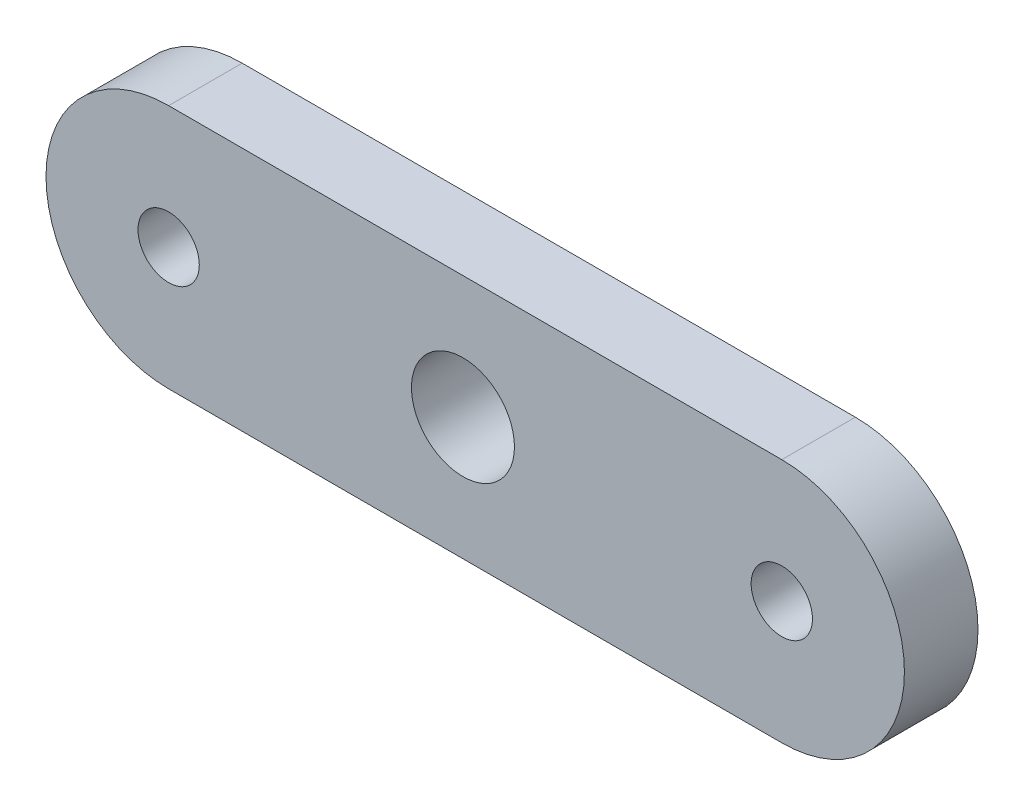
ISO-10303-21;
HEADER;
FILE_DESCRIPTION(('STEP AP214'),'2;1');
FILE_NAME('part.step','',(''),(''),'','','');
FILE_SCHEMA(('AUTOMOTIVE_DESIGN { 1 0 10303 214 1 1 1 1 }'));
ENDSEC;
DATA;
#1=APPLICATION_CONTEXT('core data for automotive mechanical design processes');
#2=APPLICATION_PROTOCOL_DEFINITION('international standard','automotive_design',2000,#1);
#3=PRODUCT_CONTEXT('',#1,'mechanical');
#4=PRODUCT('Part','Part','',(#3));
#5=PRODUCT_RELATED_PRODUCT_CATEGORY('part','',(#4));
#6=PRODUCT_DEFINITION_FORMATION('','',#4);
#7=PRODUCT_DEFINITION_CONTEXT('part definition',#1,'design');
#8=PRODUCT_DEFINITION('design','',#6,#7);
#9=PRODUCT_DEFINITION_SHAPE('','',#8);
#10=(LENGTH_UNIT() NAMED_UNIT(*) SI_UNIT(.MILLI.,.METRE.));
#11=(NAMED_UNIT(*) PLANE_ANGLE_UNIT() SI_UNIT($,.RADIAN.));
#12=(NAMED_UNIT(*) SI_UNIT($,.STERADIAN.) SOLID_ANGLE_UNIT());
#13=UNCERTAINTY_MEASURE_WITH_UNIT(LENGTH_MEASURE(1.E-05),#10,'distance_accuracy_value','');
#14=(GEOMETRIC_REPRESENTATION_CONTEXT(3) GLOBAL_UNCERTAINTY_ASSIGNED_CONTEXT((#13)) GLOBAL_UNIT_ASSIGNED_CONTEXT((#10,
#11,#12)) REPRESENTATION_CONTEXT('',''));
#15=CARTESIAN_POINT('',(0.,0.,0.));
#16=DIRECTION('',(0.,0.,1.));
#17=DIRECTION('',(1.,0.,0.));
#18=AXIS2_PLACEMENT_3D('',#15,#16,#17);
#19=CARTESIAN_POINT('',(-78.0152195047561,26.0203372792721,3.));
#20=DIRECTION('',(0.,0.,1.));
#21=DIRECTION('',(1.,0.,0.));
#22=AXIS2_PLACEMENT_3D('',#19,#20,#21);
#23=PLANE('',#22);
#24=CARTESIAN_POINT('',(-66.0152195047561,26.0203372792721,3.));
#25=DIRECTION('',(0.,0.,1.));
#26=DIRECTION('',(1.,0.,0.));
#27=AXIS2_PLACEMENT_3D('',#24,#25,#26);
#28=CIRCLE('',#27,2.1);
#29=CARTESIAN_POINT('',(-63.9152195047561,26.0203372792721,3.));
#30=VERTEX_POINT('',#29);
#31=EDGE_CURVE('E126',#30,#30,#28,.T.);
#32=ORIENTED_EDGE('',*,*,#31,.F.);
#33=EDGE_LOOP('',(#32));
#34=FACE_BOUND('',#33,.T.);
#35=CARTESIAN_POINT('',(-53.0152195047561,26.0203372792721,3.));
#36=DIRECTION('',(0.,0.,1.));
#37=DIRECTION('',(1.,0.,0.));
#38=AXIS2_PLACEMENT_3D('',#35,#36,#37);
#39=CIRCLE('',#38,1.25);
#40=CARTESIAN_POINT('',(-51.7652195047561,26.0203372792721,3.));
#41=VERTEX_POINT('',#40);
#42=EDGE_CURVE('E100',#41,#41,#39,.T.);
#43=ORIENTED_EDGE('',*,*,#42,.F.);
#44=EDGE_LOOP('',(#43));
#45=FACE_BOUND('',#44,.T.);
#46=CARTESIAN_POINT('',(-78.0152195047561,26.0203372792721,3.));
#47=DIRECTION('',(0.,0.,1.));
#48=DIRECTION('',(1.,0.,0.));
#49=AXIS2_PLACEMENT_3D('',#46,#47,#48);
#50=CIRCLE('',#49,5.);
#51=CARTESIAN_POINT('',(-78.0152195047561,31.0203372792721,3.));
#52=VERTEX_POINT('',#51);
#53=CARTESIAN_POINT('',(-78.0152195047561,21.0203372792721,3.));
#54=VERTEX_POINT('',#53);
#55=EDGE_CURVE('E85',#52,#54,#50,.T.);
#56=ORIENTED_EDGE('',*,*,#55,.T.);
#57=DIRECTION('',(1.,0.,0.));
#58=VECTOR('',#57,1.);
#59=CARTESIAN_POINT('',(-53.0152195047561,21.0203372792721,3.));
#60=LINE('',#59,#58);
#61=CARTESIAN_POINT('',(-53.0152195047561,21.0203372792721,3.));
#62=VERTEX_POINT('',#61);
#63=EDGE_CURVE('E80',#54,#62,#60,.T.);
#64=ORIENTED_EDGE('',*,*,#63,.T.);
#65=CARTESIAN_POINT('',(-53.0152195047561,26.0203372792721,3.));
#66=DIRECTION('',(0.,0.,1.));
#67=DIRECTION('',(1.,0.,0.));
#68=AXIS2_PLACEMENT_3D('',#65,#66,#67);
#69=CIRCLE('',#68,5.);
#70=CARTESIAN_POINT('',(-53.0152195047561,31.0203372792721,3.));
#71=VERTEX_POINT('',#70);
#72=EDGE_CURVE('E83',#62,#71,#69,.T.);
#73=ORIENTED_EDGE('',*,*,#72,.T.);
#74=DIRECTION('',(-1.,0.,0.));
#75=VECTOR('',#74,1.);
#76=CARTESIAN_POINT('',(-78.0152195047561,31.0203372792721,3.));
#77=LINE('',#76,#75);
#78=EDGE_CURVE('E50',#71,#52,#77,.T.);
#79=ORIENTED_EDGE('',*,*,#78,.T.);
#80=EDGE_LOOP('',(#56,#64,#73,#79));
#81=FACE_BOUND('',#80,.T.);
#82=CARTESIAN_POINT('',(-78.0152195047561,26.0203372792721,3.));
#83=DIRECTION('',(0.,0.,1.));
#84=DIRECTION('',(1.,0.,0.));
#85=AXIS2_PLACEMENT_3D('',#82,#83,#84);
#86=CIRCLE('',#85,1.25);
#87=CARTESIAN_POINT('',(-76.7652195047561,26.0203372792721,3.));
#88=VERTEX_POINT('',#87);
#89=EDGE_CURVE('E115',#88,#88,#86,.T.);
#90=ORIENTED_EDGE('',*,*,#89,.F.);
#91=EDGE_LOOP('',(#90));
#92=FACE_BOUND('',#91,.T.);
#93=ADVANCED_FACE('F33',(#34,#45,#81,#92),#23,.T.);
#94=CARTESIAN_POINT('',(-78.0152195047561,26.0203372792721,0.));
#95=DIRECTION('',(0.,0.,1.));
#96=DIRECTION('',(1.,0.,0.));
#97=AXIS2_PLACEMENT_3D('',#94,#95,#96);
#98=PLANE('',#97);
#99=CARTESIAN_POINT('',(-53.0152195047561,26.0203372792721,0.));
#100=DIRECTION('',(0.,0.,1.));
#101=DIRECTION('',(1.,0.,0.));
#102=AXIS2_PLACEMENT_3D('',#99,#100,#101);
#103=CIRCLE('',#102,1.25);
#104=CARTESIAN_POINT('',(-51.7652195047561,26.0203372792721,0.));
#105=VERTEX_POINT('',#104);
#106=EDGE_CURVE('E112',#105,#105,#103,.T.);
#107=ORIENTED_EDGE('',*,*,#106,.T.);
#108=EDGE_LOOP('',(#107));
#109=FACE_BOUND('',#108,.T.);
#110=CARTESIAN_POINT('',(-78.0152195047561,26.0203372792721,0.));
#111=DIRECTION('',(0.,0.,1.));
#112=DIRECTION('',(1.,0.,0.));
#113=AXIS2_PLACEMENT_3D('',#110,#111,#112);
#114=CIRCLE('',#113,5.);
#115=CARTESIAN_POINT('',(-78.0152195047561,31.0203372792721,0.));
#116=VERTEX_POINT('',#115);
#117=CARTESIAN_POINT('',(-78.0152195047561,21.0203372792721,0.));
#118=VERTEX_POINT('',#117);
#119=EDGE_CURVE('E97',#116,#118,#114,.T.);
#120=ORIENTED_EDGE('',*,*,#119,.F.);
#121=DIRECTION('',(-1.,0.,0.));
#122=VECTOR('',#121,1.);
#123=CARTESIAN_POINT('',(-78.0152195047561,31.0203372792721,0.));
#124=LINE('',#123,#122);
#125=CARTESIAN_POINT('',(-53.0152195047561,31.0203372792721,0.));
#126=VERTEX_POINT('',#125);
#127=EDGE_CURVE('E73',#126,#116,#124,.T.);
#128=ORIENTED_EDGE('',*,*,#127,.F.);
#129=CARTESIAN_POINT('',(-53.0152195047561,26.0203372792721,0.));
#130=DIRECTION('',(0.,0.,1.));
#131=DIRECTION('',(1.,0.,0.));
#132=AXIS2_PLACEMENT_3D('',#129,#130,#131);
#133=CIRCLE('',#132,5.);
#134=CARTESIAN_POINT('',(-53.0152195047561,21.0203372792721,0.));
#135=VERTEX_POINT('',#134);
#136=EDGE_CURVE('E67',#135,#126,#133,.T.);
#137=ORIENTED_EDGE('',*,*,#136,.F.);
#138=DIRECTION('',(1.,0.,0.));
#139=VECTOR('',#138,1.);
#140=CARTESIAN_POINT('',(-53.0152195047561,21.0203372792721,0.));
#141=LINE('',#140,#139);
#142=EDGE_CURVE('E89',#118,#135,#141,.T.);
#143=ORIENTED_EDGE('',*,*,#142,.F.);
#144=EDGE_LOOP('',(#120,#128,#137,#143));
#145=FACE_BOUND('',#144,.T.);
#146=CARTESIAN_POINT('',(-66.0152195047561,26.0203372792721,0.));
#147=DIRECTION('',(0.,0.,1.));
#148=DIRECTION('',(1.,0.,0.));
#149=AXIS2_PLACEMENT_3D('',#146,#147,#148);
#150=CIRCLE('',#149,2.1);
#151=CARTESIAN_POINT('',(-63.9152195047561,26.0203372792721,0.));
#152=VERTEX_POINT('',#151);
#153=EDGE_CURVE('E121',#152,#152,#150,.T.);
#154=ORIENTED_EDGE('',*,*,#153,.T.);
#155=EDGE_LOOP('',(#154));
#156=FACE_BOUND('',#155,.T.);
#157=CARTESIAN_POINT('',(-78.0152195047561,26.0203372792721,0.));
#158=DIRECTION('',(0.,0.,1.));
#159=DIRECTION('',(1.,0.,0.));
#160=AXIS2_PLACEMENT_3D('',#157,#158,#159);
#161=CIRCLE('',#160,1.25);
#162=CARTESIAN_POINT('',(-76.7652195047561,26.0203372792721,0.));
#163=VERTEX_POINT('',#162);
#164=EDGE_CURVE('E118',#163,#163,#161,.T.);
#165=ORIENTED_EDGE('',*,*,#164,.T.);
#166=EDGE_LOOP('',(#165));
#167=FACE_BOUND('',#166,.T.);
#168=ADVANCED_FACE('F108',(#109,#145,#156,#167),#98,.F.);
#169=CARTESIAN_POINT('',(-78.0152195047561,26.0203372792721,3.));
#170=DIRECTION('',(0.,0.,-1.));
#171=DIRECTION('',(-1.,0.,0.));
#172=AXIS2_PLACEMENT_3D('',#169,#170,#171);
#173=CYLINDRICAL_SURFACE('',#172,5.);
#174=ORIENTED_EDGE('',*,*,#119,.T.);
#175=DIRECTION('',(0.,0.,-1.));
#176=VECTOR('',#175,1.);
#177=CARTESIAN_POINT('',(-78.0152195047561,21.0203372792721,3.));
#178=LINE('',#177,#176);
#179=EDGE_CURVE('E11',#54,#118,#178,.T.);
#180=ORIENTED_EDGE('',*,*,#179,.F.);
#181=ORIENTED_EDGE('',*,*,#55,.F.);
#182=DIRECTION('',(0.,0.,-1.));
#183=VECTOR('',#182,1.);
#184=CARTESIAN_POINT('',(-78.0152195047561,31.0203372792721,3.));
#185=LINE('',#184,#183);
#186=EDGE_CURVE('E93',#52,#116,#185,.T.);
#187=ORIENTED_EDGE('',*,*,#186,.T.);
#188=EDGE_LOOP('',(#174,#180,#181,#187));
#189=FACE_BOUND('',#188,.T.);
#190=ADVANCED_FACE('F35',(#189),#173,.T.);
#191=CARTESIAN_POINT('',(-53.0152195047561,21.0203372792721,3.));
#192=DIRECTION('',(0.,1.,0.));
#193=DIRECTION('',(0.,0.,1.));
#194=AXIS2_PLACEMENT_3D('',#191,#192,#193);
#195=PLANE('',#194);
#196=ORIENTED_EDGE('',*,*,#142,.T.);
#197=DIRECTION('',(0.,0.,-1.));
#198=VECTOR('',#197,1.);
#199=CARTESIAN_POINT('',(-53.0152195047561,21.0203372792721,3.));
#200=LINE('',#199,#198);
#201=EDGE_CURVE('E42',#62,#135,#200,.T.);
#202=ORIENTED_EDGE('',*,*,#201,.F.);
#203=ORIENTED_EDGE('',*,*,#63,.F.);
#204=ORIENTED_EDGE('',*,*,#179,.T.);
#205=EDGE_LOOP('',(#196,#202,#203,#204));
#206=FACE_BOUND('',#205,.T.);
#207=ADVANCED_FACE('F88',(#206),#195,.F.);
#208=CARTESIAN_POINT('',(-53.0152195047561,26.0203372792721,3.));
#209=DIRECTION('',(0.,0.,-1.));
#210=DIRECTION('',(-1.,0.,0.));
#211=AXIS2_PLACEMENT_3D('',#208,#209,#210);
#212=CYLINDRICAL_SURFACE('',#211,5.);
#213=ORIENTED_EDGE('',*,*,#136,.T.);
#214=DIRECTION('',(0.,0.,-1.));
#215=VECTOR('',#214,1.);
#216=CARTESIAN_POINT('',(-53.0152195047561,31.0203372792721,3.));
#217=LINE('',#216,#215);
#218=EDGE_CURVE('E90',#71,#126,#217,.T.);
#219=ORIENTED_EDGE('',*,*,#218,.F.);
#220=ORIENTED_EDGE('',*,*,#72,.F.);
#221=ORIENTED_EDGE('',*,*,#201,.T.);
#222=EDGE_LOOP('',(#213,#219,#220,#221));
#223=FACE_BOUND('',#222,.T.);
#224=ADVANCED_FACE('F91',(#223),#212,.T.);
#225=CARTESIAN_POINT('',(-78.0152195047561,31.0203372792721,3.));
#226=DIRECTION('',(0.,-1.,0.));
#227=DIRECTION('',(0.,0.,-1.));
#228=AXIS2_PLACEMENT_3D('',#225,#226,#227);
#229=PLANE('',#228);
#230=ORIENTED_EDGE('',*,*,#127,.T.);
#231=ORIENTED_EDGE('',*,*,#186,.F.);
#232=ORIENTED_EDGE('',*,*,#78,.F.);
#233=ORIENTED_EDGE('',*,*,#218,.T.);
#234=EDGE_LOOP('',(#230,#231,#232,#233));
#235=FACE_BOUND('',#234,.T.);
#236=ADVANCED_FACE('F105',(#235),#229,.F.);
#237=CARTESIAN_POINT('',(-53.0152195047561,26.0203372792721,3.));
#238=DIRECTION('',(0.,0.,-1.));
#239=DIRECTION('',(-1.,0.,0.));
#240=AXIS2_PLACEMENT_3D('',#237,#238,#239);
#241=CYLINDRICAL_SURFACE('',#240,1.25);
#242=ORIENTED_EDGE('',*,*,#42,.T.);
#243=EDGE_LOOP('',(#242));
#244=FACE_BOUND('',#243,.T.);
#245=ORIENTED_EDGE('',*,*,#106,.F.);
#246=EDGE_LOOP('',(#245));
#247=FACE_BOUND('',#246,.T.);
#248=ADVANCED_FACE('F138',(#244,#247),#241,.F.);
#249=CARTESIAN_POINT('',(-78.0152195047561,26.0203372792721,3.));
#250=DIRECTION('',(0.,0.,-1.));
#251=DIRECTION('',(-1.,0.,0.));
#252=AXIS2_PLACEMENT_3D('',#249,#250,#251);
#253=CYLINDRICAL_SURFACE('',#252,1.25);
#254=ORIENTED_EDGE('',*,*,#89,.T.);
#255=EDGE_LOOP('',(#254));
#256=FACE_BOUND('',#255,.T.);
#257=ORIENTED_EDGE('',*,*,#164,.F.);
#258=EDGE_LOOP('',(#257));
#259=FACE_BOUND('',#258,.T.);
#260=ADVANCED_FACE('F141',(#256,#259),#253,.F.);
#261=CARTESIAN_POINT('',(-66.0152195047561,26.0203372792721,-7.));
#262=DIRECTION('',(0.,0.,1.));
#263=DIRECTION('',(1.,0.,0.));
#264=AXIS2_PLACEMENT_3D('',#261,#262,#263);
#265=CYLINDRICAL_SURFACE('',#264,2.1);
#266=ORIENTED_EDGE('',*,*,#31,.T.);
#267=EDGE_LOOP('',(#266));
#268=FACE_BOUND('',#267,.T.);
#269=ORIENTED_EDGE('',*,*,#153,.F.);
#270=EDGE_LOOP('',(#269));
#271=FACE_BOUND('',#270,.T.);
#272=ADVANCED_FACE('F130',(#268,#271),#265,.F.);
#273=CLOSED_SHELL('',(#93,#168,#190,#207,#224,#236,#248,#260,#272));
#274=MANIFOLD_SOLID_BREP('B2',#273);
#275=ADVANCED_BREP_SHAPE_REPRESENTATION('',(#18,#274),#14);
#276=SHAPE_DEFINITION_REPRESENTATION(#9,#275);
ENDSEC;
END-ISO-10303-21;
